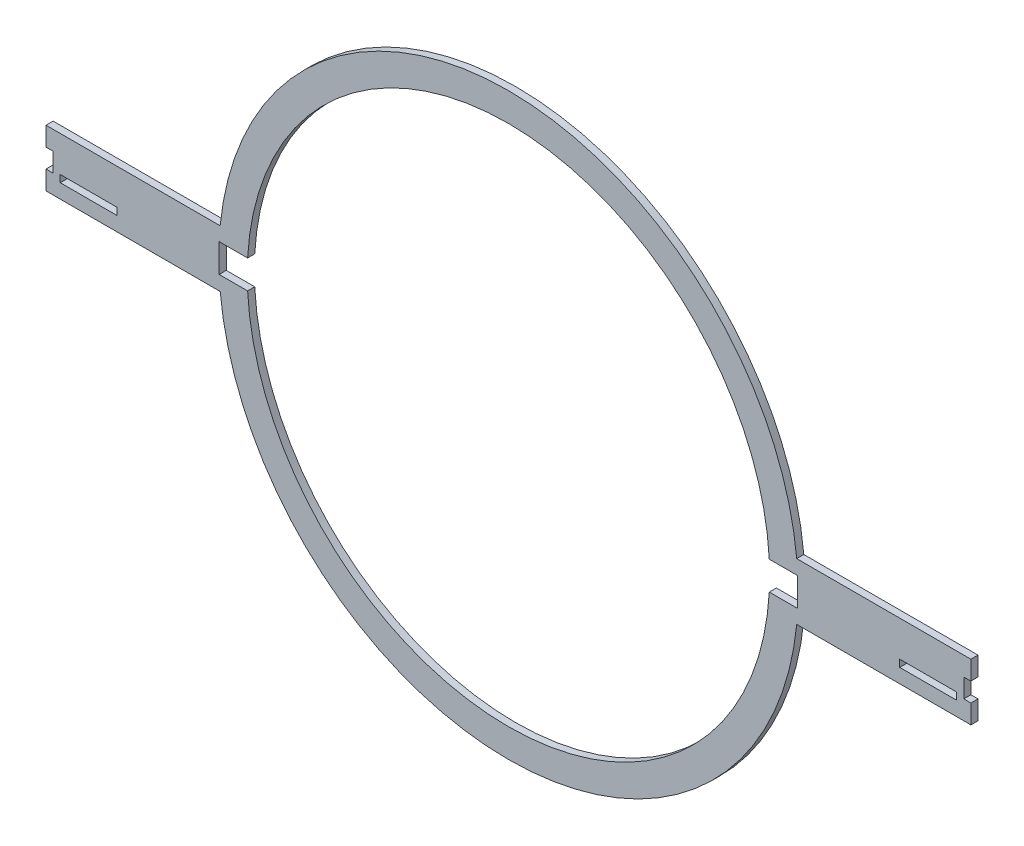
ISO-10303-21;
HEADER;
FILE_DESCRIPTION(('STEP AP214'),'2;1');
FILE_NAME('part.step','',(''),(''),'','','');
FILE_SCHEMA(('AUTOMOTIVE_DESIGN { 1 0 10303 214 1 1 1 1 }'));
ENDSEC;
DATA;
#1=APPLICATION_CONTEXT('core data for automotive mechanical design processes');
#2=APPLICATION_PROTOCOL_DEFINITION('international standard','automotive_design',2000,#1);
#3=PRODUCT_CONTEXT('',#1,'mechanical');
#4=PRODUCT('Part','Part','',(#3));
#5=PRODUCT_RELATED_PRODUCT_CATEGORY('part','',(#4));
#6=PRODUCT_DEFINITION_FORMATION('','',#4);
#7=PRODUCT_DEFINITION_CONTEXT('part definition',#1,'design');
#8=PRODUCT_DEFINITION('design','',#6,#7);
#9=PRODUCT_DEFINITION_SHAPE('','',#8);
#10=(LENGTH_UNIT() NAMED_UNIT(*) SI_UNIT(.MILLI.,.METRE.));
#11=(NAMED_UNIT(*) PLANE_ANGLE_UNIT() SI_UNIT($,.RADIAN.));
#12=(NAMED_UNIT(*) SI_UNIT($,.STERADIAN.) SOLID_ANGLE_UNIT());
#13=UNCERTAINTY_MEASURE_WITH_UNIT(LENGTH_MEASURE(1.E-05),#10,'distance_accuracy_value','');
#14=(GEOMETRIC_REPRESENTATION_CONTEXT(3) GLOBAL_UNCERTAINTY_ASSIGNED_CONTEXT((#13)) GLOBAL_UNIT_ASSIGNED_CONTEXT((#10,
#11,#12)) REPRESENTATION_CONTEXT('',''));
#15=CARTESIAN_POINT('',(0.,0.,0.));
#16=DIRECTION('',(0.,0.,1.));
#17=DIRECTION('',(1.,0.,0.));
#18=AXIS2_PLACEMENT_3D('',#15,#16,#17);
#19=CARTESIAN_POINT('',(0.,0.,3.175));
#20=DIRECTION('',(0.,0.,1.));
#21=DIRECTION('',(1.,0.,0.));
#22=AXIS2_PLACEMENT_3D('',#19,#20,#21);
#23=PLANE('',#22);
#24=DIRECTION('',(0.,1.,0.));
#25=VECTOR('',#24,1.);
#26=CARTESIAN_POINT('',(200.025,-3.175,3.175));
#27=LINE('',#26,#25);
#28=CARTESIAN_POINT('',(200.025,-6.35,3.175));
#29=VERTEX_POINT('',#28);
#30=CARTESIAN_POINT('',(200.025,-3.175,3.175));
#31=VERTEX_POINT('',#30);
#32=EDGE_CURVE('E276',#29,#31,#27,.T.);
#33=ORIENTED_EDGE('',*,*,#32,.F.);
#34=DIRECTION('',(1.,0.,0.));
#35=VECTOR('',#34,1.);
#36=CARTESIAN_POINT('',(200.025,-6.35,3.175));
#37=LINE('',#36,#35);
#38=CARTESIAN_POINT('',(174.625,-6.35,3.175));
#39=VERTEX_POINT('',#38);
#40=EDGE_CURVE('E284',#39,#29,#37,.T.);
#41=ORIENTED_EDGE('',*,*,#40,.F.);
#42=DIRECTION('',(0.,-1.,0.));
#43=VECTOR('',#42,1.);
#44=CARTESIAN_POINT('',(174.625,-3.17500000000001,3.175));
#45=LINE('',#44,#43);
#46=CARTESIAN_POINT('',(174.625,-3.17500000000001,3.175));
#47=VERTEX_POINT('',#46);
#48=EDGE_CURVE('E298',#47,#39,#45,.T.);
#49=ORIENTED_EDGE('',*,*,#48,.F.);
#50=DIRECTION('',(-1.,0.,0.));
#51=VECTOR('',#50,1.);
#52=CARTESIAN_POINT('',(200.025,-3.175,3.175));
#53=LINE('',#52,#51);
#54=EDGE_CURVE('E295',#31,#47,#53,.T.);
#55=ORIENTED_EDGE('',*,*,#54,.F.);
#56=EDGE_LOOP('',(#33,#41,#49,#55));
#57=FACE_BOUND('',#56,.T.);
#58=DIRECTION('',(-1.,0.,0.));
#59=VECTOR('',#58,1.);
#60=CARTESIAN_POINT('',(129.100222391927,6.35,3.175));
#61=LINE('',#60,#59);
#62=CARTESIAN_POINT('',(129.100222391927,6.35,3.175));
#63=VERTEX_POINT('',#62);
#64=CARTESIAN_POINT('',(116.400222391927,6.35000000000002,3.175));
#65=VERTEX_POINT('',#64);
#66=EDGE_CURVE('E305',#63,#65,#61,.T.);
#67=ORIENTED_EDGE('',*,*,#66,.F.);
#68=DIRECTION('',(0.,1.,0.));
#69=VECTOR('',#68,1.);
#70=CARTESIAN_POINT('',(129.100222391927,-6.35,3.175));
#71=LINE('',#70,#69);
#72=CARTESIAN_POINT('',(129.100222391927,-6.35,3.175));
#73=VERTEX_POINT('',#72);
#74=EDGE_CURVE('E324',#73,#63,#71,.T.);
#75=ORIENTED_EDGE('',*,*,#74,.F.);
#76=DIRECTION('',(1.,0.,0.));
#77=VECTOR('',#76,1.);
#78=CARTESIAN_POINT('',(116.400222391927,-6.35,3.175));
#79=LINE('',#78,#77);
#80=CARTESIAN_POINT('',(116.400222391927,-6.34999999999999,3.175));
#81=VERTEX_POINT('',#80);
#82=EDGE_CURVE('E316',#81,#73,#79,.T.);
#83=ORIENTED_EDGE('',*,*,#82,.F.);
#84=CARTESIAN_POINT('',(0.,0.,3.175));
#85=DIRECTION('',(0.,0.,1.));
#86=DIRECTION('',(1.,0.,0.));
#87=AXIS2_PLACEMENT_3D('',#84,#85,#86);
#88=CIRCLE('',#87,116.5733);
#89=CARTESIAN_POINT('',(-116.400222391927,-6.35,3.175));
#90=VERTEX_POINT('',#89);
#91=EDGE_CURVE('E438',#90,#81,#88,.T.);
#92=ORIENTED_EDGE('',*,*,#91,.F.);
#93=DIRECTION('',(-1.,0.,0.));
#94=VECTOR('',#93,1.);
#95=CARTESIAN_POINT('',(-116.400222391927,-6.35,3.175));
#96=LINE('',#95,#94);
#97=CARTESIAN_POINT('',(-129.100222391927,-6.35,3.175));
#98=VERTEX_POINT('',#97);
#99=EDGE_CURVE('E349',#90,#98,#96,.T.);
#100=ORIENTED_EDGE('',*,*,#99,.T.);
#101=DIRECTION('',(0.,1.,0.));
#102=VECTOR('',#101,1.);
#103=CARTESIAN_POINT('',(-129.100222391927,-6.35,3.175));
#104=LINE('',#103,#102);
#105=CARTESIAN_POINT('',(-129.100222391927,6.35,3.175));
#106=VERTEX_POINT('',#105);
#107=EDGE_CURVE('E342',#98,#106,#104,.T.);
#108=ORIENTED_EDGE('',*,*,#107,.T.);
#109=DIRECTION('',(1.,0.,0.));
#110=VECTOR('',#109,1.);
#111=CARTESIAN_POINT('',(-129.100222391927,6.35,3.175));
#112=LINE('',#111,#110);
#113=CARTESIAN_POINT('',(-116.400222391927,6.35000000000002,3.175));
#114=VERTEX_POINT('',#113);
#115=EDGE_CURVE('E337',#106,#114,#112,.T.);
#116=ORIENTED_EDGE('',*,*,#115,.T.);
#117=EDGE_CURVE('E437',#65,#114,#88,.T.);
#118=ORIENTED_EDGE('',*,*,#117,.F.);
#119=EDGE_LOOP('',(#67,#75,#83,#92,#100,#108,#116,#118));
#120=FACE_BOUND('',#119,.T.);
#121=DIRECTION('',(0.,1.,0.));
#122=VECTOR('',#121,1.);
#123=CARTESIAN_POINT('',(206.375,0.,3.175));
#124=LINE('',#123,#122);
#125=CARTESIAN_POINT('',(206.375,-12.7,3.175));
#126=VERTEX_POINT('',#125);
#127=CARTESIAN_POINT('',(206.375,-4.23333333333333,3.175));
#128=VERTEX_POINT('',#127);
#129=EDGE_CURVE('E425',#126,#128,#124,.T.);
#130=ORIENTED_EDGE('',*,*,#129,.T.);
#131=DIRECTION('',(-1.,0.,0.));
#132=VECTOR('',#131,1.);
#133=CARTESIAN_POINT('',(206.375,-4.23333333333333,3.175));
#134=LINE('',#133,#132);
#135=CARTESIAN_POINT('',(203.2,-4.23333333333333,3.175));
#136=VERTEX_POINT('',#135);
#137=EDGE_CURVE('E367',#128,#136,#134,.T.);
#138=ORIENTED_EDGE('',*,*,#137,.T.);
#139=DIRECTION('',(0.,1.,0.));
#140=VECTOR('',#139,1.);
#141=CARTESIAN_POINT('',(203.2,4.23333333333333,3.175));
#142=LINE('',#141,#140);
#143=CARTESIAN_POINT('',(203.2,4.23333333333333,3.175));
#144=VERTEX_POINT('',#143);
#145=EDGE_CURVE('E375',#136,#144,#142,.T.);
#146=ORIENTED_EDGE('',*,*,#145,.T.);
#147=DIRECTION('',(1.,0.,0.));
#148=VECTOR('',#147,1.);
#149=CARTESIAN_POINT('',(206.375,4.23333333333333,3.175));
#150=LINE('',#149,#148);
#151=CARTESIAN_POINT('',(206.375,4.23333333333333,3.175));
#152=VERTEX_POINT('',#151);
#153=EDGE_CURVE('E363',#144,#152,#150,.T.);
#154=ORIENTED_EDGE('',*,*,#153,.T.);
#155=CARTESIAN_POINT('',(206.375,12.7,3.175));
#156=VERTEX_POINT('',#155);
#157=EDGE_CURVE('E424',#152,#156,#124,.T.);
#158=ORIENTED_EDGE('',*,*,#157,.T.);
#159=DIRECTION('',(-1.,0.,0.));
#160=VECTOR('',#159,1.);
#161=CARTESIAN_POINT('',(0.,12.7,3.175));
#162=LINE('',#161,#160);
#163=CARTESIAN_POINT('',(128.647954095236,12.7,3.175));
#164=VERTEX_POINT('',#163);
#165=EDGE_CURVE('E428',#156,#164,#162,.T.);
#166=ORIENTED_EDGE('',*,*,#165,.T.);
#167=CARTESIAN_POINT('',(0.,0.,3.175));
#168=DIRECTION('',(0.,0.,1.));
#169=DIRECTION('',(1.,0.,0.));
#170=AXIS2_PLACEMENT_3D('',#167,#168,#169);
#171=CIRCLE('',#170,129.2733);
#172=CARTESIAN_POINT('',(-128.647954095236,12.7,3.175));
#173=VERTEX_POINT('',#172);
#174=EDGE_CURVE('E422',#164,#173,#171,.T.);
#175=ORIENTED_EDGE('',*,*,#174,.T.);
#176=DIRECTION('',(1.,0.,0.));
#177=VECTOR('',#176,1.);
#178=CARTESIAN_POINT('',(0.,12.7,3.175));
#179=LINE('',#178,#177);
#180=CARTESIAN_POINT('',(-206.375,12.7,3.175));
#181=VERTEX_POINT('',#180);
#182=EDGE_CURVE('E430',#181,#173,#179,.T.);
#183=ORIENTED_EDGE('',*,*,#182,.F.);
#184=DIRECTION('',(0.,1.,0.));
#185=VECTOR('',#184,1.);
#186=CARTESIAN_POINT('',(-206.375,0.,3.175));
#187=LINE('',#186,#185);
#188=CARTESIAN_POINT('',(-206.375,4.23333333333333,3.175));
#189=VERTEX_POINT('',#188);
#190=EDGE_CURVE('E433',#189,#181,#187,.T.);
#191=ORIENTED_EDGE('',*,*,#190,.F.);
#192=DIRECTION('',(-1.,0.,0.));
#193=VECTOR('',#192,1.);
#194=CARTESIAN_POINT('',(-206.375,4.23333333333333,3.175));
#195=LINE('',#194,#193);
#196=CARTESIAN_POINT('',(-203.2,4.23333333333333,3.175));
#197=VERTEX_POINT('',#196);
#198=EDGE_CURVE('E393',#197,#189,#195,.T.);
#199=ORIENTED_EDGE('',*,*,#198,.F.);
#200=DIRECTION('',(0.,1.,0.));
#201=VECTOR('',#200,1.);
#202=CARTESIAN_POINT('',(-203.2,4.23333333333333,3.175));
#203=LINE('',#202,#201);
#204=CARTESIAN_POINT('',(-203.2,-4.23333333333333,3.175));
#205=VERTEX_POINT('',#204);
#206=EDGE_CURVE('E402',#205,#197,#203,.T.);
#207=ORIENTED_EDGE('',*,*,#206,.F.);
#208=DIRECTION('',(1.,0.,0.));
#209=VECTOR('',#208,1.);
#210=CARTESIAN_POINT('',(-206.375,-4.23333333333333,3.175));
#211=LINE('',#210,#209);
#212=CARTESIAN_POINT('',(-206.375,-4.23333333333333,3.175));
#213=VERTEX_POINT('',#212);
#214=EDGE_CURVE('E383',#213,#205,#211,.T.);
#215=ORIENTED_EDGE('',*,*,#214,.F.);
#216=CARTESIAN_POINT('',(-206.375,-12.7,3.175));
#217=VERTEX_POINT('',#216);
#218=EDGE_CURVE('E434',#217,#213,#187,.T.);
#219=ORIENTED_EDGE('',*,*,#218,.F.);
#220=DIRECTION('',(-1.,0.,0.));
#221=VECTOR('',#220,1.);
#222=CARTESIAN_POINT('',(0.,-12.7,3.175));
#223=LINE('',#222,#221);
#224=CARTESIAN_POINT('',(-128.647954095236,-12.7,3.175));
#225=VERTEX_POINT('',#224);
#226=EDGE_CURVE('E415',#225,#217,#223,.T.);
#227=ORIENTED_EDGE('',*,*,#226,.F.);
#228=CARTESIAN_POINT('',(128.647954095236,-12.7,3.175));
#229=VERTEX_POINT('',#228);
#230=EDGE_CURVE('E418',#225,#229,#171,.T.);
#231=ORIENTED_EDGE('',*,*,#230,.T.);
#232=DIRECTION('',(1.,0.,0.));
#233=VECTOR('',#232,1.);
#234=CARTESIAN_POINT('',(0.,-12.7,3.175));
#235=LINE('',#234,#233);
#236=EDGE_CURVE('E421',#229,#126,#235,.T.);
#237=ORIENTED_EDGE('',*,*,#236,.T.);
#238=EDGE_LOOP('',(#130,#138,#146,#154,#158,#166,#175,#183,#191,#199,#207,#215,#219,#227,#231,#237));
#239=FACE_BOUND('',#238,.T.);
#240=DIRECTION('',(-1.,0.,0.));
#241=VECTOR('',#240,1.);
#242=CARTESIAN_POINT('',(-200.025,-6.35,3.175));
#243=LINE('',#242,#241);
#244=CARTESIAN_POINT('',(-174.625,-6.35,3.175));
#245=VERTEX_POINT('',#244);
#246=CARTESIAN_POINT('',(-200.025,-6.35,3.175));
#247=VERTEX_POINT('',#246);
#248=EDGE_CURVE('E270',#245,#247,#243,.T.);
#249=ORIENTED_EDGE('',*,*,#248,.T.);
#250=DIRECTION('',(0.,1.,0.));
#251=VECTOR('',#250,1.);
#252=CARTESIAN_POINT('',(-200.025,-3.175,3.175));
#253=LINE('',#252,#251);
#254=CARTESIAN_POINT('',(-200.025,-3.175,3.175));
#255=VERTEX_POINT('',#254);
#256=EDGE_CURVE('E52',#247,#255,#253,.T.);
#257=ORIENTED_EDGE('',*,*,#256,.T.);
#258=DIRECTION('',(1.,0.,0.));
#259=VECTOR('',#258,1.);
#260=CARTESIAN_POINT('',(-200.025,-3.175,3.175));
#261=LINE('',#260,#259);
#262=CARTESIAN_POINT('',(-174.625,-3.17500000000001,3.175));
#263=VERTEX_POINT('',#262);
#264=EDGE_CURVE('E261',#255,#263,#261,.T.);
#265=ORIENTED_EDGE('',*,*,#264,.T.);
#266=DIRECTION('',(0.,-1.,0.));
#267=VECTOR('',#266,1.);
#268=CARTESIAN_POINT('',(-174.625,-3.17500000000001,3.175));
#269=LINE('',#268,#267);
#270=EDGE_CURVE('E264',#263,#245,#269,.T.);
#271=ORIENTED_EDGE('',*,*,#270,.T.);
#272=EDGE_LOOP('',(#249,#257,#265,#271));
#273=FACE_BOUND('',#272,.T.);
#274=ADVANCED_FACE('F37',(#57,#120,#239,#273),#23,.T.);
#275=CARTESIAN_POINT('',(0.,0.,0.));
#276=DIRECTION('',(0.,0.,1.));
#277=DIRECTION('',(1.,0.,0.));
#278=AXIS2_PLACEMENT_3D('',#275,#276,#277);
#279=PLANE('',#278);
#280=DIRECTION('',(0.,1.,0.));
#281=VECTOR('',#280,1.);
#282=CARTESIAN_POINT('',(129.100222391927,-6.35,0.));
#283=LINE('',#282,#281);
#284=CARTESIAN_POINT('',(129.100222391927,-6.35,0.));
#285=VERTEX_POINT('',#284);
#286=CARTESIAN_POINT('',(129.100222391927,6.35,0.));
#287=VERTEX_POINT('',#286);
#288=EDGE_CURVE('E315',#285,#287,#283,.T.);
#289=ORIENTED_EDGE('',*,*,#288,.T.);
#290=DIRECTION('',(-1.,0.,0.));
#291=VECTOR('',#290,1.);
#292=CARTESIAN_POINT('',(129.100222391927,6.35,0.));
#293=LINE('',#292,#291);
#294=CARTESIAN_POINT('',(116.400222391927,6.35000000000002,0.));
#295=VERTEX_POINT('',#294);
#296=EDGE_CURVE('E312',#287,#295,#293,.T.);
#297=ORIENTED_EDGE('',*,*,#296,.T.);
#298=CARTESIAN_POINT('',(0.,0.,0.));
#299=DIRECTION('',(0.,0.,1.));
#300=DIRECTION('',(1.,0.,0.));
#301=AXIS2_PLACEMENT_3D('',#298,#299,#300);
#302=CIRCLE('',#301,116.5733);
#303=CARTESIAN_POINT('',(-116.400222391927,6.35000000000002,0.));
#304=VERTEX_POINT('',#303);
#305=EDGE_CURVE('E462',#295,#304,#302,.T.);
#306=ORIENTED_EDGE('',*,*,#305,.T.);
#307=DIRECTION('',(1.,0.,0.));
#308=VECTOR('',#307,1.);
#309=CARTESIAN_POINT('',(-129.100222391927,6.35,0.));
#310=LINE('',#309,#308);
#311=CARTESIAN_POINT('',(-129.100222391927,6.35,0.));
#312=VERTEX_POINT('',#311);
#313=EDGE_CURVE('E338',#312,#304,#310,.T.);
#314=ORIENTED_EDGE('',*,*,#313,.F.);
#315=DIRECTION('',(0.,1.,0.));
#316=VECTOR('',#315,1.);
#317=CARTESIAN_POINT('',(-129.100222391927,-6.35,0.));
#318=LINE('',#317,#316);
#319=CARTESIAN_POINT('',(-129.100222391927,-6.35,0.));
#320=VERTEX_POINT('',#319);
#321=EDGE_CURVE('E344',#320,#312,#318,.T.);
#322=ORIENTED_EDGE('',*,*,#321,.F.);
#323=DIRECTION('',(-1.,0.,0.));
#324=VECTOR('',#323,1.);
#325=CARTESIAN_POINT('',(-116.400222391927,-6.35,0.));
#326=LINE('',#325,#324);
#327=CARTESIAN_POINT('',(-116.400222391927,-6.34999999999999,0.));
#328=VERTEX_POINT('',#327);
#329=EDGE_CURVE('E341',#328,#320,#326,.T.);
#330=ORIENTED_EDGE('',*,*,#329,.F.);
#331=CARTESIAN_POINT('',(116.400222391927,-6.35,0.));
#332=VERTEX_POINT('',#331);
#333=EDGE_CURVE('E419',#328,#332,#302,.T.);
#334=ORIENTED_EDGE('',*,*,#333,.T.);
#335=DIRECTION('',(1.,0.,0.));
#336=VECTOR('',#335,1.);
#337=CARTESIAN_POINT('',(116.400222391927,-6.35,0.));
#338=LINE('',#337,#336);
#339=EDGE_CURVE('E319',#332,#285,#338,.T.);
#340=ORIENTED_EDGE('',*,*,#339,.T.);
#341=EDGE_LOOP('',(#289,#297,#306,#314,#322,#330,#334,#340));
#342=FACE_BOUND('',#341,.T.);
#343=DIRECTION('',(-1.,0.,0.));
#344=VECTOR('',#343,1.);
#345=CARTESIAN_POINT('',(206.375,-4.23333333333333,0.));
#346=LINE('',#345,#344);
#347=CARTESIAN_POINT('',(206.375,-4.23333333333333,0.));
#348=VERTEX_POINT('',#347);
#349=CARTESIAN_POINT('',(203.2,-4.23333333333333,0.));
#350=VERTEX_POINT('',#349);
#351=EDGE_CURVE('E370',#348,#350,#346,.T.);
#352=ORIENTED_EDGE('',*,*,#351,.F.);
#353=DIRECTION('',(0.,1.,0.));
#354=VECTOR('',#353,1.);
#355=CARTESIAN_POINT('',(206.375,0.,0.));
#356=LINE('',#355,#354);
#357=CARTESIAN_POINT('',(206.375,-12.7,0.));
#358=VERTEX_POINT('',#357);
#359=EDGE_CURVE('E450',#358,#348,#356,.T.);
#360=ORIENTED_EDGE('',*,*,#359,.F.);
#361=DIRECTION('',(1.,0.,0.));
#362=VECTOR('',#361,1.);
#363=CARTESIAN_POINT('',(0.,-12.7,0.));
#364=LINE('',#363,#362);
#365=CARTESIAN_POINT('',(128.647954095236,-12.7,0.));
#366=VERTEX_POINT('',#365);
#367=EDGE_CURVE('E446',#366,#358,#364,.T.);
#368=ORIENTED_EDGE('',*,*,#367,.F.);
#369=CARTESIAN_POINT('',(0.,0.,0.));
#370=DIRECTION('',(0.,0.,1.));
#371=DIRECTION('',(1.,0.,0.));
#372=AXIS2_PLACEMENT_3D('',#369,#370,#371);
#373=CIRCLE('',#372,129.2733);
#374=CARTESIAN_POINT('',(-128.647954095236,-12.7,0.));
#375=VERTEX_POINT('',#374);
#376=EDGE_CURVE('E444',#375,#366,#373,.T.);
#377=ORIENTED_EDGE('',*,*,#376,.F.);
#378=DIRECTION('',(-1.,0.,0.));
#379=VECTOR('',#378,1.);
#380=CARTESIAN_POINT('',(0.,-12.7,0.));
#381=LINE('',#380,#379);
#382=CARTESIAN_POINT('',(-206.375,-12.7,0.));
#383=VERTEX_POINT('',#382);
#384=EDGE_CURVE('E409',#375,#383,#381,.T.);
#385=ORIENTED_EDGE('',*,*,#384,.T.);
#386=DIRECTION('',(0.,1.,0.));
#387=VECTOR('',#386,1.);
#388=CARTESIAN_POINT('',(-206.375,0.,0.));
#389=LINE('',#388,#387);
#390=CARTESIAN_POINT('',(-206.375,-4.23333333333333,0.));
#391=VERTEX_POINT('',#390);
#392=EDGE_CURVE('E459',#383,#391,#389,.T.);
#393=ORIENTED_EDGE('',*,*,#392,.T.);
#394=DIRECTION('',(1.,0.,0.));
#395=VECTOR('',#394,1.);
#396=CARTESIAN_POINT('',(-206.375,-4.23333333333333,0.));
#397=LINE('',#396,#395);
#398=CARTESIAN_POINT('',(-203.2,-4.23333333333333,0.));
#399=VERTEX_POINT('',#398);
#400=EDGE_CURVE('E389',#391,#399,#397,.T.);
#401=ORIENTED_EDGE('',*,*,#400,.T.);
#402=DIRECTION('',(0.,1.,0.));
#403=VECTOR('',#402,1.);
#404=CARTESIAN_POINT('',(-203.2,4.23333333333333,0.));
#405=LINE('',#404,#403);
#406=CARTESIAN_POINT('',(-203.2,4.23333333333333,0.));
#407=VERTEX_POINT('',#406);
#408=EDGE_CURVE('E392',#399,#407,#405,.T.);
#409=ORIENTED_EDGE('',*,*,#408,.T.);
#410=DIRECTION('',(-1.,0.,0.));
#411=VECTOR('',#410,1.);
#412=CARTESIAN_POINT('',(-206.375,4.23333333333333,0.));
#413=LINE('',#412,#411);
#414=CARTESIAN_POINT('',(-206.375,4.23333333333333,0.));
#415=VERTEX_POINT('',#414);
#416=EDGE_CURVE('E396',#407,#415,#413,.T.);
#417=ORIENTED_EDGE('',*,*,#416,.T.);
#418=CARTESIAN_POINT('',(-206.375,12.7,0.));
#419=VERTEX_POINT('',#418);
#420=EDGE_CURVE('E458',#415,#419,#389,.T.);
#421=ORIENTED_EDGE('',*,*,#420,.T.);
#422=DIRECTION('',(1.,0.,0.));
#423=VECTOR('',#422,1.);
#424=CARTESIAN_POINT('',(0.,12.7,0.));
#425=LINE('',#424,#423);
#426=CARTESIAN_POINT('',(-128.647954095236,12.7,0.));
#427=VERTEX_POINT('',#426);
#428=EDGE_CURVE('E455',#419,#427,#425,.T.);
#429=ORIENTED_EDGE('',*,*,#428,.T.);
#430=CARTESIAN_POINT('',(128.647954095236,12.7,0.));
#431=VERTEX_POINT('',#430);
#432=EDGE_CURVE('E447',#431,#427,#373,.T.);
#433=ORIENTED_EDGE('',*,*,#432,.F.);
#434=DIRECTION('',(-1.,0.,0.));
#435=VECTOR('',#434,1.);
#436=CARTESIAN_POINT('',(0.,12.7,0.));
#437=LINE('',#436,#435);
#438=CARTESIAN_POINT('',(206.375,12.7,0.));
#439=VERTEX_POINT('',#438);
#440=EDGE_CURVE('E453',#439,#431,#437,.T.);
#441=ORIENTED_EDGE('',*,*,#440,.F.);
#442=CARTESIAN_POINT('',(206.375,4.23333333333333,0.));
#443=VERTEX_POINT('',#442);
#444=EDGE_CURVE('E449',#443,#439,#356,.T.);
#445=ORIENTED_EDGE('',*,*,#444,.F.);
#446=DIRECTION('',(1.,0.,0.));
#447=VECTOR('',#446,1.);
#448=CARTESIAN_POINT('',(206.375,4.23333333333333,0.));
#449=LINE('',#448,#447);
#450=CARTESIAN_POINT('',(203.2,4.23333333333333,0.));
#451=VERTEX_POINT('',#450);
#452=EDGE_CURVE('E364',#451,#443,#449,.T.);
#453=ORIENTED_EDGE('',*,*,#452,.F.);
#454=DIRECTION('',(0.,1.,0.));
#455=VECTOR('',#454,1.);
#456=CARTESIAN_POINT('',(203.2,4.23333333333333,0.));
#457=LINE('',#456,#455);
#458=EDGE_CURVE('E366',#350,#451,#457,.T.);
#459=ORIENTED_EDGE('',*,*,#458,.F.);
#460=EDGE_LOOP('',(#352,#360,#368,#377,#385,#393,#401,#409,#417,#421,#429,#433,#441,#445,#453,#459));
#461=FACE_BOUND('',#460,.T.);
#462=DIRECTION('',(1.,0.,0.));
#463=VECTOR('',#462,1.);
#464=CARTESIAN_POINT('',(200.025,-6.35,0.));
#465=LINE('',#464,#463);
#466=CARTESIAN_POINT('',(174.625,-6.35,0.));
#467=VERTEX_POINT('',#466);
#468=CARTESIAN_POINT('',(200.025,-6.35,0.));
#469=VERTEX_POINT('',#468);
#470=EDGE_CURVE('E290',#467,#469,#465,.T.);
#471=ORIENTED_EDGE('',*,*,#470,.T.);
#472=DIRECTION('',(0.,1.,0.));
#473=VECTOR('',#472,1.);
#474=CARTESIAN_POINT('',(200.025,-3.175,0.));
#475=LINE('',#474,#473);
#476=CARTESIAN_POINT('',(200.025,-3.175,0.));
#477=VERTEX_POINT('',#476);
#478=EDGE_CURVE('E280',#469,#477,#475,.T.);
#479=ORIENTED_EDGE('',*,*,#478,.T.);
#480=DIRECTION('',(-1.,0.,0.));
#481=VECTOR('',#480,1.);
#482=CARTESIAN_POINT('',(200.025,-3.175,0.));
#483=LINE('',#482,#481);
#484=CARTESIAN_POINT('',(174.625,-3.17500000000001,0.));
#485=VERTEX_POINT('',#484);
#486=EDGE_CURVE('E283',#477,#485,#483,.T.);
#487=ORIENTED_EDGE('',*,*,#486,.T.);
#488=DIRECTION('',(0.,-1.,0.));
#489=VECTOR('',#488,1.);
#490=CARTESIAN_POINT('',(174.625,-3.17500000000001,0.));
#491=LINE('',#490,#489);
#492=EDGE_CURVE('E287',#485,#467,#491,.T.);
#493=ORIENTED_EDGE('',*,*,#492,.T.);
#494=EDGE_LOOP('',(#471,#479,#487,#493));
#495=FACE_BOUND('',#494,.T.);
#496=DIRECTION('',(0.,1.,0.));
#497=VECTOR('',#496,1.);
#498=CARTESIAN_POINT('',(-200.025,-3.175,0.));
#499=LINE('',#498,#497);
#500=CARTESIAN_POINT('',(-200.025,-6.35,0.));
#501=VERTEX_POINT('',#500);
#502=CARTESIAN_POINT('',(-200.025,-3.175,0.));
#503=VERTEX_POINT('',#502);
#504=EDGE_CURVE('E253',#501,#503,#499,.T.);
#505=ORIENTED_EDGE('',*,*,#504,.F.);
#506=DIRECTION('',(-1.,0.,0.));
#507=VECTOR('',#506,1.);
#508=CARTESIAN_POINT('',(-200.025,-6.35,0.));
#509=LINE('',#508,#507);
#510=CARTESIAN_POINT('',(-174.625,-6.35,0.));
#511=VERTEX_POINT('',#510);
#512=EDGE_CURVE('E245',#511,#501,#509,.T.);
#513=ORIENTED_EDGE('',*,*,#512,.F.);
#514=DIRECTION('',(0.,-1.,0.));
#515=VECTOR('',#514,1.);
#516=CARTESIAN_POINT('',(-174.625,-3.17500000000001,0.));
#517=LINE('',#516,#515);
#518=CARTESIAN_POINT('',(-174.625,-3.17500000000001,0.));
#519=VERTEX_POINT('',#518);
#520=EDGE_CURVE('E252',#519,#511,#517,.T.);
#521=ORIENTED_EDGE('',*,*,#520,.F.);
#522=DIRECTION('',(1.,0.,0.));
#523=VECTOR('',#522,1.);
#524=CARTESIAN_POINT('',(-200.025,-3.175,0.));
#525=LINE('',#524,#523);
#526=EDGE_CURVE('E257',#503,#519,#525,.T.);
#527=ORIENTED_EDGE('',*,*,#526,.F.);
#528=EDGE_LOOP('',(#505,#513,#521,#527));
#529=FACE_BOUND('',#528,.T.);
#530=ADVANCED_FACE('F260',(#342,#461,#495,#529),#279,.F.);
#531=CARTESIAN_POINT('',(0.,0.,3.175));
#532=DIRECTION('',(0.,0.,-1.));
#533=DIRECTION('',(-1.,0.,0.));
#534=AXIS2_PLACEMENT_3D('',#531,#532,#533);
#535=CYLINDRICAL_SURFACE('',#534,116.5733);
#536=DIRECTION('',(0.,0.,1.));
#537=VECTOR('',#536,1.);
#538=CARTESIAN_POINT('',(116.400222391927,6.35000000000002,0.));
#539=LINE('',#538,#537);
#540=EDGE_CURVE('E322',#295,#65,#539,.T.);
#541=ORIENTED_EDGE('',*,*,#540,.T.);
#542=ORIENTED_EDGE('',*,*,#117,.T.);
#543=DIRECTION('',(0.,0.,1.));
#544=VECTOR('',#543,1.);
#545=CARTESIAN_POINT('',(-116.400222391927,6.35000000000002,0.));
#546=LINE('',#545,#544);
#547=EDGE_CURVE('E360',#304,#114,#546,.T.);
#548=ORIENTED_EDGE('',*,*,#547,.F.);
#549=ORIENTED_EDGE('',*,*,#305,.F.);
#550=EDGE_LOOP('',(#541,#542,#548,#549));
#551=FACE_BOUND('',#550,.T.);
#552=ADVANCED_FACE('F570',(#551),#535,.F.);
#553=DIRECTION('',(0.,0.,1.));
#554=VECTOR('',#553,1.);
#555=CARTESIAN_POINT('',(116.400222391927,-6.34999999999999,0.));
#556=LINE('',#555,#554);
#557=EDGE_CURVE('E331',#332,#81,#556,.T.);
#558=ORIENTED_EDGE('',*,*,#557,.F.);
#559=ORIENTED_EDGE('',*,*,#333,.F.);
#560=DIRECTION('',(0.,0.,1.));
#561=VECTOR('',#560,1.);
#562=CARTESIAN_POINT('',(-116.400222391927,-6.34999999999999,0.));
#563=LINE('',#562,#561);
#564=EDGE_CURVE('E357',#328,#90,#563,.T.);
#565=ORIENTED_EDGE('',*,*,#564,.T.);
#566=ORIENTED_EDGE('',*,*,#91,.T.);
#567=EDGE_LOOP('',(#558,#559,#565,#566));
#568=FACE_BOUND('',#567,.T.);
#569=ADVANCED_FACE('F577',(#568),#535,.F.);
#570=CARTESIAN_POINT('',(206.375,0.,3.175));
#571=DIRECTION('',(-1.,0.,0.));
#572=DIRECTION('',(0.,0.,1.));
#573=AXIS2_PLACEMENT_3D('',#570,#571,#572);
#574=PLANE('',#573);
#575=DIRECTION('',(0.,0.,1.));
#576=VECTOR('',#575,1.);
#577=CARTESIAN_POINT('',(206.375,-4.23333333333333,0.));
#578=LINE('',#577,#576);
#579=EDGE_CURVE('E380',#348,#128,#578,.T.);
#580=ORIENTED_EDGE('',*,*,#579,.T.);
#581=ORIENTED_EDGE('',*,*,#129,.F.);
#582=DIRECTION('',(0.,0.,-1.));
#583=VECTOR('',#582,1.);
#584=CARTESIAN_POINT('',(206.375,-12.7,3.175));
#585=LINE('',#584,#583);
#586=EDGE_CURVE('E477',#126,#358,#585,.T.);
#587=ORIENTED_EDGE('',*,*,#586,.T.);
#588=ORIENTED_EDGE('',*,*,#359,.T.);
#589=EDGE_LOOP('',(#580,#581,#587,#588));
#590=FACE_BOUND('',#589,.T.);
#591=ADVANCED_FACE('F496',(#590),#574,.F.);
#592=DIRECTION('',(0.,0.,1.));
#593=VECTOR('',#592,1.);
#594=CARTESIAN_POINT('',(206.375,4.23333333333333,0.));
#595=LINE('',#594,#593);
#596=EDGE_CURVE('E372',#443,#152,#595,.T.);
#597=ORIENTED_EDGE('',*,*,#596,.F.);
#598=ORIENTED_EDGE('',*,*,#444,.T.);
#599=DIRECTION('',(0.,0.,-1.));
#600=VECTOR('',#599,1.);
#601=CARTESIAN_POINT('',(206.375,12.7,3.175));
#602=LINE('',#601,#600);
#603=EDGE_CURVE('E474',#156,#439,#602,.T.);
#604=ORIENTED_EDGE('',*,*,#603,.F.);
#605=ORIENTED_EDGE('',*,*,#157,.F.);
#606=EDGE_LOOP('',(#597,#598,#604,#605));
#607=FACE_BOUND('',#606,.T.);
#608=ADVANCED_FACE('F543',(#607),#574,.F.);
#609=CARTESIAN_POINT('',(-206.375,0.,3.175));
#610=DIRECTION('',(-1.,0.,0.));
#611=DIRECTION('',(0.,0.,1.));
#612=AXIS2_PLACEMENT_3D('',#609,#610,#611);
#613=PLANE('',#612);
#614=DIRECTION('',(0.,0.,1.));
#615=VECTOR('',#614,1.);
#616=CARTESIAN_POINT('',(-206.375,4.23333333333333,0.));
#617=LINE('',#616,#615);
#618=EDGE_CURVE('E406',#415,#189,#617,.T.);
#619=ORIENTED_EDGE('',*,*,#618,.T.);
#620=ORIENTED_EDGE('',*,*,#190,.T.);
#621=DIRECTION('',(0.,0.,-1.));
#622=VECTOR('',#621,1.);
#623=CARTESIAN_POINT('',(-206.375,12.7,3.175));
#624=LINE('',#623,#622);
#625=EDGE_CURVE('E466',#181,#419,#624,.T.);
#626=ORIENTED_EDGE('',*,*,#625,.T.);
#627=ORIENTED_EDGE('',*,*,#420,.F.);
#628=EDGE_LOOP('',(#619,#620,#626,#627));
#629=FACE_BOUND('',#628,.T.);
#630=ADVANCED_FACE('F521',(#629),#613,.T.);
#631=CARTESIAN_POINT('',(0.,-12.7,3.175));
#632=DIRECTION('',(0.,-1.,0.));
#633=DIRECTION('',(0.,0.,-1.));
#634=AXIS2_PLACEMENT_3D('',#631,#632,#633);
#635=PLANE('',#634);
#636=ORIENTED_EDGE('',*,*,#384,.F.);
#637=DIRECTION('',(0.,0.,-1.));
#638=VECTOR('',#637,1.);
#639=CARTESIAN_POINT('',(-128.647954095236,-12.7,3.175));
#640=LINE('',#639,#638);
#641=EDGE_CURVE('E11',#225,#375,#640,.T.);
#642=ORIENTED_EDGE('',*,*,#641,.F.);
#643=ORIENTED_EDGE('',*,*,#226,.T.);
#644=DIRECTION('',(0.,0.,-1.));
#645=VECTOR('',#644,1.);
#646=CARTESIAN_POINT('',(-206.375,-12.7,3.175));
#647=LINE('',#646,#645);
#648=EDGE_CURVE('E441',#217,#383,#647,.T.);
#649=ORIENTED_EDGE('',*,*,#648,.T.);
#650=EDGE_LOOP('',(#636,#642,#643,#649));
#651=FACE_BOUND('',#650,.T.);
#652=ADVANCED_FACE('F39',(#651),#635,.T.);
#653=CARTESIAN_POINT('',(0.,0.,3.175));
#654=DIRECTION('',(0.,0.,-1.));
#655=DIRECTION('',(-1.,0.,0.));
#656=AXIS2_PLACEMENT_3D('',#653,#654,#655);
#657=CYLINDRICAL_SURFACE('',#656,129.2733);
#658=ORIENTED_EDGE('',*,*,#376,.T.);
#659=DIRECTION('',(0.,0.,-1.));
#660=VECTOR('',#659,1.);
#661=CARTESIAN_POINT('',(128.647954095236,-12.7,3.175));
#662=LINE('',#661,#660);
#663=EDGE_CURVE('E45',#229,#366,#662,.T.);
#664=ORIENTED_EDGE('',*,*,#663,.F.);
#665=ORIENTED_EDGE('',*,*,#230,.F.);
#666=ORIENTED_EDGE('',*,*,#641,.T.);
#667=EDGE_LOOP('',(#658,#664,#665,#666));
#668=FACE_BOUND('',#667,.T.);
#669=ADVANCED_FACE('F502',(#668),#657,.T.);
#670=CARTESIAN_POINT('',(0.,-12.7,3.175));
#671=DIRECTION('',(0.,1.,0.));
#672=DIRECTION('',(0.,0.,1.));
#673=AXIS2_PLACEMENT_3D('',#670,#671,#672);
#674=PLANE('',#673);
#675=ORIENTED_EDGE('',*,*,#367,.T.);
#676=ORIENTED_EDGE('',*,*,#586,.F.);
#677=ORIENTED_EDGE('',*,*,#236,.F.);
#678=ORIENTED_EDGE('',*,*,#663,.T.);
#679=EDGE_LOOP('',(#675,#676,#677,#678));
#680=FACE_BOUND('',#679,.T.);
#681=ADVANCED_FACE('F484',(#680),#674,.F.);
#682=CARTESIAN_POINT('',(0.,12.7,3.175));
#683=DIRECTION('',(0.,-1.,0.));
#684=DIRECTION('',(0.,0.,-1.));
#685=AXIS2_PLACEMENT_3D('',#682,#683,#684);
#686=PLANE('',#685);
#687=ORIENTED_EDGE('',*,*,#440,.T.);
#688=DIRECTION('',(0.,0.,-1.));
#689=VECTOR('',#688,1.);
#690=CARTESIAN_POINT('',(128.647954095236,12.7,3.175));
#691=LINE('',#690,#689);
#692=EDGE_CURVE('E471',#164,#431,#691,.T.);
#693=ORIENTED_EDGE('',*,*,#692,.F.);
#694=ORIENTED_EDGE('',*,*,#165,.F.);
#695=ORIENTED_EDGE('',*,*,#603,.T.);
#696=EDGE_LOOP('',(#687,#693,#694,#695));
#697=FACE_BOUND('',#696,.T.);
#698=ADVANCED_FACE('F538',(#697),#686,.F.);
#699=ORIENTED_EDGE('',*,*,#432,.T.);
#700=DIRECTION('',(0.,0.,-1.));
#701=VECTOR('',#700,1.);
#702=CARTESIAN_POINT('',(-128.647954095236,12.7,3.175));
#703=LINE('',#702,#701);
#704=EDGE_CURVE('E469',#173,#427,#703,.T.);
#705=ORIENTED_EDGE('',*,*,#704,.F.);
#706=ORIENTED_EDGE('',*,*,#174,.F.);
#707=ORIENTED_EDGE('',*,*,#692,.T.);
#708=EDGE_LOOP('',(#699,#705,#706,#707));
#709=FACE_BOUND('',#708,.T.);
#710=ADVANCED_FACE('F533',(#709),#657,.T.);
#711=CARTESIAN_POINT('',(0.,12.7,3.175));
#712=DIRECTION('',(0.,1.,0.));
#713=DIRECTION('',(0.,0.,1.));
#714=AXIS2_PLACEMENT_3D('',#711,#712,#713);
#715=PLANE('',#714);
#716=ORIENTED_EDGE('',*,*,#428,.F.);
#717=ORIENTED_EDGE('',*,*,#625,.F.);
#718=ORIENTED_EDGE('',*,*,#182,.T.);
#719=ORIENTED_EDGE('',*,*,#704,.T.);
#720=EDGE_LOOP('',(#716,#717,#718,#719));
#721=FACE_BOUND('',#720,.T.);
#722=ADVANCED_FACE('F526',(#721),#715,.T.);
#723=DIRECTION('',(0.,0.,1.));
#724=VECTOR('',#723,1.);
#725=CARTESIAN_POINT('',(-206.375,-4.23333333333333,0.));
#726=LINE('',#725,#724);
#727=EDGE_CURVE('E399',#391,#213,#726,.T.);
#728=ORIENTED_EDGE('',*,*,#727,.F.);
#729=ORIENTED_EDGE('',*,*,#392,.F.);
#730=ORIENTED_EDGE('',*,*,#648,.F.);
#731=ORIENTED_EDGE('',*,*,#218,.T.);
#732=EDGE_LOOP('',(#728,#729,#730,#731));
#733=FACE_BOUND('',#732,.T.);
#734=ADVANCED_FACE('F507',(#733),#613,.T.);
#735=CARTESIAN_POINT('',(-206.375,4.23333333333333,0.));
#736=DIRECTION('',(0.,1.,0.));
#737=DIRECTION('',(0.,0.,1.));
#738=AXIS2_PLACEMENT_3D('',#735,#736,#737);
#739=PLANE('',#738);
#740=ORIENTED_EDGE('',*,*,#198,.T.);
#741=ORIENTED_EDGE('',*,*,#618,.F.);
#742=ORIENTED_EDGE('',*,*,#416,.F.);
#743=DIRECTION('',(0.,0.,1.));
#744=VECTOR('',#743,1.);
#745=CARTESIAN_POINT('',(-203.2,4.23333333333333,0.));
#746=LINE('',#745,#744);
#747=EDGE_CURVE('E410',#407,#197,#746,.T.);
#748=ORIENTED_EDGE('',*,*,#747,.T.);
#749=EDGE_LOOP('',(#740,#741,#742,#748));
#750=FACE_BOUND('',#749,.T.);
#751=ADVANCED_FACE('F583',(#750),#739,.F.);
#752=CARTESIAN_POINT('',(-203.2,4.23333333333333,0.));
#753=DIRECTION('',(1.,0.,0.));
#754=DIRECTION('',(0.,0.,-1.));
#755=AXIS2_PLACEMENT_3D('',#752,#753,#754);
#756=PLANE('',#755);
#757=ORIENTED_EDGE('',*,*,#206,.T.);
#758=ORIENTED_EDGE('',*,*,#747,.F.);
#759=ORIENTED_EDGE('',*,*,#408,.F.);
#760=DIRECTION('',(0.,0.,1.));
#761=VECTOR('',#760,1.);
#762=CARTESIAN_POINT('',(-203.2,-4.23333333333333,0.));
#763=LINE('',#762,#761);
#764=EDGE_CURVE('E412',#399,#205,#763,.T.);
#765=ORIENTED_EDGE('',*,*,#764,.T.);
#766=EDGE_LOOP('',(#757,#758,#759,#765));
#767=FACE_BOUND('',#766,.T.);
#768=ADVANCED_FACE('F516',(#767),#756,.F.);
#769=CARTESIAN_POINT('',(-206.375,-4.23333333333333,0.));
#770=DIRECTION('',(0.,-1.,0.));
#771=DIRECTION('',(0.,0.,-1.));
#772=AXIS2_PLACEMENT_3D('',#769,#770,#771);
#773=PLANE('',#772);
#774=ORIENTED_EDGE('',*,*,#214,.T.);
#775=ORIENTED_EDGE('',*,*,#764,.F.);
#776=ORIENTED_EDGE('',*,*,#400,.F.);
#777=ORIENTED_EDGE('',*,*,#727,.T.);
#778=EDGE_LOOP('',(#774,#775,#776,#777));
#779=FACE_BOUND('',#778,.T.);
#780=ADVANCED_FACE('F510',(#779),#773,.F.);
#781=CARTESIAN_POINT('',(206.375,-4.23333333333333,0.));
#782=DIRECTION('',(0.,1.,0.));
#783=DIRECTION('',(0.,0.,1.));
#784=AXIS2_PLACEMENT_3D('',#781,#782,#783);
#785=PLANE('',#784);
#786=ORIENTED_EDGE('',*,*,#137,.F.);
#787=ORIENTED_EDGE('',*,*,#579,.F.);
#788=ORIENTED_EDGE('',*,*,#351,.T.);
#789=DIRECTION('',(0.,0.,1.));
#790=VECTOR('',#789,1.);
#791=CARTESIAN_POINT('',(203.2,-4.23333333333333,0.));
#792=LINE('',#791,#790);
#793=EDGE_CURVE('E384',#350,#136,#792,.T.);
#794=ORIENTED_EDGE('',*,*,#793,.T.);
#795=EDGE_LOOP('',(#786,#787,#788,#794));
#796=FACE_BOUND('',#795,.T.);
#797=ADVANCED_FACE('F553',(#796),#785,.T.);
#798=CARTESIAN_POINT('',(203.2,4.23333333333333,0.));
#799=DIRECTION('',(1.,0.,0.));
#800=DIRECTION('',(0.,0.,-1.));
#801=AXIS2_PLACEMENT_3D('',#798,#799,#800);
#802=PLANE('',#801);
#803=ORIENTED_EDGE('',*,*,#145,.F.);
#804=ORIENTED_EDGE('',*,*,#793,.F.);
#805=ORIENTED_EDGE('',*,*,#458,.T.);
#806=DIRECTION('',(0.,0.,1.));
#807=VECTOR('',#806,1.);
#808=CARTESIAN_POINT('',(203.2,4.23333333333333,0.));
#809=LINE('',#808,#807);
#810=EDGE_CURVE('E386',#451,#144,#809,.T.);
#811=ORIENTED_EDGE('',*,*,#810,.T.);
#812=EDGE_LOOP('',(#803,#804,#805,#811));
#813=FACE_BOUND('',#812,.T.);
#814=ADVANCED_FACE('F551',(#813),#802,.T.);
#815=CARTESIAN_POINT('',(206.375,4.23333333333333,0.));
#816=DIRECTION('',(0.,-1.,0.));
#817=DIRECTION('',(0.,0.,-1.));
#818=AXIS2_PLACEMENT_3D('',#815,#816,#817);
#819=PLANE('',#818);
#820=ORIENTED_EDGE('',*,*,#153,.F.);
#821=ORIENTED_EDGE('',*,*,#810,.F.);
#822=ORIENTED_EDGE('',*,*,#452,.T.);
#823=ORIENTED_EDGE('',*,*,#596,.T.);
#824=EDGE_LOOP('',(#820,#821,#822,#823));
#825=FACE_BOUND('',#824,.T.);
#826=ADVANCED_FACE('F547',(#825),#819,.T.);
#827=CARTESIAN_POINT('',(-129.100222391927,6.35,0.));
#828=DIRECTION('',(0.,-1.,0.));
#829=DIRECTION('',(1.,0.,0.));
#830=AXIS2_PLACEMENT_3D('',#827,#828,#829);
#831=PLANE('',#830);
#832=ORIENTED_EDGE('',*,*,#115,.F.);
#833=DIRECTION('',(0.,0.,1.));
#834=VECTOR('',#833,1.);
#835=CARTESIAN_POINT('',(-129.100222391927,6.35,0.));
#836=LINE('',#835,#834);
#837=EDGE_CURVE('E346',#312,#106,#836,.T.);
#838=ORIENTED_EDGE('',*,*,#837,.F.);
#839=ORIENTED_EDGE('',*,*,#313,.T.);
#840=ORIENTED_EDGE('',*,*,#547,.T.);
#841=EDGE_LOOP('',(#832,#838,#839,#840));
#842=FACE_BOUND('',#841,.T.);
#843=ADVANCED_FACE('F645',(#842),#831,.T.);
#844=CARTESIAN_POINT('',(-116.400222391927,-6.35,0.));
#845=DIRECTION('',(0.,1.,0.));
#846=DIRECTION('',(-1.,0.,0.));
#847=AXIS2_PLACEMENT_3D('',#844,#845,#846);
#848=PLANE('',#847);
#849=ORIENTED_EDGE('',*,*,#99,.F.);
#850=ORIENTED_EDGE('',*,*,#564,.F.);
#851=ORIENTED_EDGE('',*,*,#329,.T.);
#852=DIRECTION('',(0.,0.,1.));
#853=VECTOR('',#852,1.);
#854=CARTESIAN_POINT('',(-129.100222391927,-6.35,0.));
#855=LINE('',#854,#853);
#856=EDGE_CURVE('E355',#320,#98,#855,.T.);
#857=ORIENTED_EDGE('',*,*,#856,.T.);
#858=EDGE_LOOP('',(#849,#850,#851,#857));
#859=FACE_BOUND('',#858,.T.);
#860=ADVANCED_FACE('F634',(#859),#848,.T.);
#861=CARTESIAN_POINT('',(-129.100222391927,-6.35,0.));
#862=DIRECTION('',(1.,0.,0.));
#863=DIRECTION('',(0.,0.,-1.));
#864=AXIS2_PLACEMENT_3D('',#861,#862,#863);
#865=PLANE('',#864);
#866=ORIENTED_EDGE('',*,*,#107,.F.);
#867=ORIENTED_EDGE('',*,*,#856,.F.);
#868=ORIENTED_EDGE('',*,*,#321,.T.);
#869=ORIENTED_EDGE('',*,*,#837,.T.);
#870=EDGE_LOOP('',(#866,#867,#868,#869));
#871=FACE_BOUND('',#870,.T.);
#872=ADVANCED_FACE('F629',(#871),#865,.T.);
#873=CARTESIAN_POINT('',(129.100222391927,6.35,0.));
#874=DIRECTION('',(0.,1.,0.));
#875=DIRECTION('',(-1.,0.,0.));
#876=AXIS2_PLACEMENT_3D('',#873,#874,#875);
#877=PLANE('',#876);
#878=ORIENTED_EDGE('',*,*,#66,.T.);
#879=ORIENTED_EDGE('',*,*,#540,.F.);
#880=ORIENTED_EDGE('',*,*,#296,.F.);
#881=DIRECTION('',(0.,0.,1.));
#882=VECTOR('',#881,1.);
#883=CARTESIAN_POINT('',(129.100222391927,6.35,0.));
#884=LINE('',#883,#882);
#885=EDGE_CURVE('E335',#287,#63,#884,.T.);
#886=ORIENTED_EDGE('',*,*,#885,.T.);
#887=EDGE_LOOP('',(#878,#879,#880,#886));
#888=FACE_BOUND('',#887,.T.);
#889=ADVANCED_FACE('F633',(#888),#877,.F.);
#890=CARTESIAN_POINT('',(129.100222391927,-6.35,0.));
#891=DIRECTION('',(1.,0.,0.));
#892=DIRECTION('',(0.,0.,-1.));
#893=AXIS2_PLACEMENT_3D('',#890,#891,#892);
#894=PLANE('',#893);
#895=ORIENTED_EDGE('',*,*,#74,.T.);
#896=ORIENTED_EDGE('',*,*,#885,.F.);
#897=ORIENTED_EDGE('',*,*,#288,.F.);
#898=DIRECTION('',(0.,0.,1.));
#899=VECTOR('',#898,1.);
#900=CARTESIAN_POINT('',(129.100222391927,-6.35,0.));
#901=LINE('',#900,#899);
#902=EDGE_CURVE('E333',#285,#73,#901,.T.);
#903=ORIENTED_EDGE('',*,*,#902,.T.);
#904=EDGE_LOOP('',(#895,#896,#897,#903));
#905=FACE_BOUND('',#904,.T.);
#906=ADVANCED_FACE('F745',(#905),#894,.F.);
#907=CARTESIAN_POINT('',(116.400222391927,-6.35,0.));
#908=DIRECTION('',(0.,-1.,0.));
#909=DIRECTION('',(1.,0.,0.));
#910=AXIS2_PLACEMENT_3D('',#907,#908,#909);
#911=PLANE('',#910);
#912=ORIENTED_EDGE('',*,*,#82,.T.);
#913=ORIENTED_EDGE('',*,*,#902,.F.);
#914=ORIENTED_EDGE('',*,*,#339,.F.);
#915=ORIENTED_EDGE('',*,*,#557,.T.);
#916=EDGE_LOOP('',(#912,#913,#914,#915));
#917=FACE_BOUND('',#916,.T.);
#918=ADVANCED_FACE('F749',(#917),#911,.F.);
#919=CARTESIAN_POINT('',(200.025,-3.175,0.));
#920=DIRECTION('',(1.,0.,0.));
#921=DIRECTION('',(0.,0.,-1.));
#922=AXIS2_PLACEMENT_3D('',#919,#920,#921);
#923=PLANE('',#922);
#924=ORIENTED_EDGE('',*,*,#32,.T.);
#925=DIRECTION('',(0.,0.,1.));
#926=VECTOR('',#925,1.);
#927=CARTESIAN_POINT('',(200.025,-3.175,0.));
#928=LINE('',#927,#926);
#929=EDGE_CURVE('E293',#477,#31,#928,.T.);
#930=ORIENTED_EDGE('',*,*,#929,.F.);
#931=ORIENTED_EDGE('',*,*,#478,.F.);
#932=DIRECTION('',(0.,0.,1.));
#933=VECTOR('',#932,1.);
#934=CARTESIAN_POINT('',(200.025,-6.35,0.));
#935=LINE('',#934,#933);
#936=EDGE_CURVE('E303',#469,#29,#935,.T.);
#937=ORIENTED_EDGE('',*,*,#936,.T.);
#938=EDGE_LOOP('',(#924,#930,#931,#937));
#939=FACE_BOUND('',#938,.T.);
#940=ADVANCED_FACE('F753',(#939),#923,.F.);
#941=CARTESIAN_POINT('',(200.025,-6.35,0.));
#942=DIRECTION('',(0.,-1.,0.));
#943=DIRECTION('',(1.,0.,0.));
#944=AXIS2_PLACEMENT_3D('',#941,#942,#943);
#945=PLANE('',#944);
#946=ORIENTED_EDGE('',*,*,#40,.T.);
#947=ORIENTED_EDGE('',*,*,#936,.F.);
#948=ORIENTED_EDGE('',*,*,#470,.F.);
#949=DIRECTION('',(0.,0.,1.));
#950=VECTOR('',#949,1.);
#951=CARTESIAN_POINT('',(174.625,-6.35,0.));
#952=LINE('',#951,#950);
#953=EDGE_CURVE('E306',#467,#39,#952,.T.);
#954=ORIENTED_EDGE('',*,*,#953,.T.);
#955=EDGE_LOOP('',(#946,#947,#948,#954));
#956=FACE_BOUND('',#955,.T.);
#957=ADVANCED_FACE('F757',(#956),#945,.F.);
#958=CARTESIAN_POINT('',(174.625,-3.17500000000001,0.));
#959=DIRECTION('',(-1.,0.,0.));
#960=DIRECTION('',(0.,0.,1.));
#961=AXIS2_PLACEMENT_3D('',#958,#959,#960);
#962=PLANE('',#961);
#963=ORIENTED_EDGE('',*,*,#48,.T.);
#964=ORIENTED_EDGE('',*,*,#953,.F.);
#965=ORIENTED_EDGE('',*,*,#492,.F.);
#966=DIRECTION('',(0.,0.,1.));
#967=VECTOR('',#966,1.);
#968=CARTESIAN_POINT('',(174.625,-3.17500000000001,0.));
#969=LINE('',#968,#967);
#970=EDGE_CURVE('E308',#485,#47,#969,.T.);
#971=ORIENTED_EDGE('',*,*,#970,.T.);
#972=EDGE_LOOP('',(#963,#964,#965,#971));
#973=FACE_BOUND('',#972,.T.);
#974=ADVANCED_FACE('F762',(#973),#962,.F.);
#975=CARTESIAN_POINT('',(200.025,-3.175,0.));
#976=DIRECTION('',(0.,1.,0.));
#977=DIRECTION('',(-1.,0.,0.));
#978=AXIS2_PLACEMENT_3D('',#975,#976,#977);
#979=PLANE('',#978);
#980=ORIENTED_EDGE('',*,*,#54,.T.);
#981=ORIENTED_EDGE('',*,*,#970,.F.);
#982=ORIENTED_EDGE('',*,*,#486,.F.);
#983=ORIENTED_EDGE('',*,*,#929,.T.);
#984=EDGE_LOOP('',(#980,#981,#982,#983));
#985=FACE_BOUND('',#984,.T.);
#986=ADVANCED_FACE('F759',(#985),#979,.F.);
#987=CARTESIAN_POINT('',(-200.025,-3.175,0.));
#988=DIRECTION('',(1.,0.,0.));
#989=DIRECTION('',(0.,0.,-1.));
#990=AXIS2_PLACEMENT_3D('',#987,#988,#989);
#991=PLANE('',#990);
#992=ORIENTED_EDGE('',*,*,#256,.F.);
#993=DIRECTION('',(0.,0.,1.));
#994=VECTOR('',#993,1.);
#995=CARTESIAN_POINT('',(-200.025,-6.35,0.));
#996=LINE('',#995,#994);
#997=EDGE_CURVE('E247',#501,#247,#996,.T.);
#998=ORIENTED_EDGE('',*,*,#997,.F.);
#999=ORIENTED_EDGE('',*,*,#504,.T.);
#1000=DIRECTION('',(0.,0.,1.));
#1001=VECTOR('',#1000,1.);
#1002=CARTESIAN_POINT('',(-200.025,-3.175,0.));
#1003=LINE('',#1002,#1001);
#1004=EDGE_CURVE('E274',#503,#255,#1003,.T.);
#1005=ORIENTED_EDGE('',*,*,#1004,.T.);
#1006=EDGE_LOOP('',(#992,#998,#999,#1005));
#1007=FACE_BOUND('',#1006,.T.);
#1008=ADVANCED_FACE('F255',(#1007),#991,.T.);
#1009=CARTESIAN_POINT('',(-200.025,-3.175,0.));
#1010=DIRECTION('',(0.,-1.,0.));
#1011=DIRECTION('',(1.,0.,0.));
#1012=AXIS2_PLACEMENT_3D('',#1009,#1010,#1011);
#1013=PLANE('',#1012);
#1014=ORIENTED_EDGE('',*,*,#264,.F.);
#1015=ORIENTED_EDGE('',*,*,#1004,.F.);
#1016=ORIENTED_EDGE('',*,*,#526,.T.);
#1017=DIRECTION('',(0.,0.,1.));
#1018=VECTOR('',#1017,1.);
#1019=CARTESIAN_POINT('',(-174.625,-3.17500000000001,0.));
#1020=LINE('',#1019,#1018);
#1021=EDGE_CURVE('E277',#519,#263,#1020,.T.);
#1022=ORIENTED_EDGE('',*,*,#1021,.T.);
#1023=EDGE_LOOP('',(#1014,#1015,#1016,#1022));
#1024=FACE_BOUND('',#1023,.T.);
#1025=ADVANCED_FACE('F772',(#1024),#1013,.T.);
#1026=CARTESIAN_POINT('',(-174.625,-3.17500000000001,0.));
#1027=DIRECTION('',(-1.,0.,0.));
#1028=DIRECTION('',(0.,0.,1.));
#1029=AXIS2_PLACEMENT_3D('',#1026,#1027,#1028);
#1030=PLANE('',#1029);
#1031=ORIENTED_EDGE('',*,*,#270,.F.);
#1032=ORIENTED_EDGE('',*,*,#1021,.F.);
#1033=ORIENTED_EDGE('',*,*,#520,.T.);
#1034=DIRECTION('',(0.,0.,1.));
#1035=VECTOR('',#1034,1.);
#1036=CARTESIAN_POINT('',(-174.625,-6.35,0.));
#1037=LINE('',#1036,#1035);
#1038=EDGE_CURVE('E60',#511,#245,#1037,.T.);
#1039=ORIENTED_EDGE('',*,*,#1038,.T.);
#1040=EDGE_LOOP('',(#1031,#1032,#1033,#1039));
#1041=FACE_BOUND('',#1040,.T.);
#1042=ADVANCED_FACE('F775',(#1041),#1030,.T.);
#1043=CARTESIAN_POINT('',(-200.025,-6.35,0.));
#1044=DIRECTION('',(0.,1.,0.));
#1045=DIRECTION('',(-1.,0.,0.));
#1046=AXIS2_PLACEMENT_3D('',#1043,#1044,#1045);
#1047=PLANE('',#1046);
#1048=ORIENTED_EDGE('',*,*,#248,.F.);
#1049=ORIENTED_EDGE('',*,*,#1038,.F.);
#1050=ORIENTED_EDGE('',*,*,#512,.T.);
#1051=ORIENTED_EDGE('',*,*,#997,.T.);
#1052=EDGE_LOOP('',(#1048,#1049,#1050,#1051));
#1053=FACE_BOUND('',#1052,.T.);
#1054=ADVANCED_FACE('F246',(#1053),#1047,.T.);
#1055=CLOSED_SHELL('',(#274,#530,#552,#569,#591,#608,#630,#652,#669,#681,#698,#710,#722,#734,
#751,#768,#780,#797,#814,#826,#843,#860,#872,#889,#906,#918,#940,#957,#974,#986,#1008,#1025,
#1042,#1054));
#1056=MANIFOLD_SOLID_BREP('B2',#1055);
#1057=ADVANCED_BREP_SHAPE_REPRESENTATION('',(#18,#1056),#14);
#1058=SHAPE_DEFINITION_REPRESENTATION(#9,#1057);
ENDSEC;
END-ISO-10303-21;
